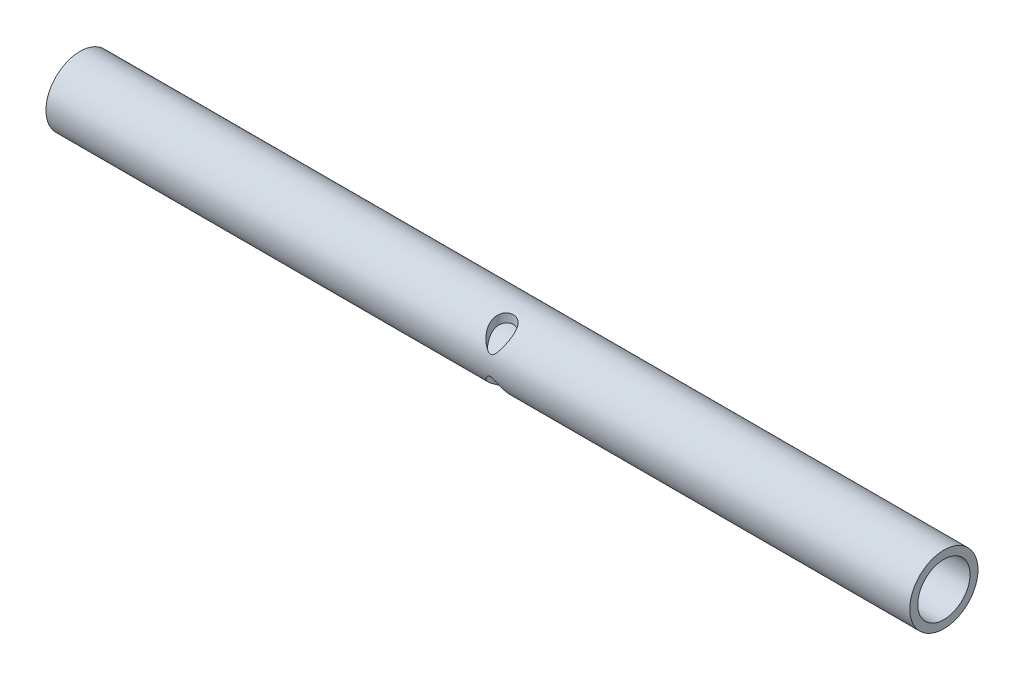
ISO-10303-21;
HEADER;
FILE_DESCRIPTION(('STEP AP214'),'2;1');
FILE_NAME('part.step','',(''),(''),'','','');
FILE_SCHEMA(('AUTOMOTIVE_DESIGN { 1 0 10303 214 1 1 1 1 }'));
ENDSEC;
DATA;
#1=APPLICATION_CONTEXT('core data for automotive mechanical design processes');
#2=APPLICATION_PROTOCOL_DEFINITION('international standard','automotive_design',2000,#1);
#3=PRODUCT_CONTEXT('',#1,'mechanical');
#4=PRODUCT('Part','Part','',(#3));
#5=PRODUCT_RELATED_PRODUCT_CATEGORY('part','',(#4));
#6=PRODUCT_DEFINITION_FORMATION('','',#4);
#7=PRODUCT_DEFINITION_CONTEXT('part definition',#1,'design');
#8=PRODUCT_DEFINITION('design','',#6,#7);
#9=PRODUCT_DEFINITION_SHAPE('','',#8);
#10=(LENGTH_UNIT() NAMED_UNIT(*) SI_UNIT(.MILLI.,.METRE.));
#11=(NAMED_UNIT(*) PLANE_ANGLE_UNIT() SI_UNIT($,.RADIAN.));
#12=(NAMED_UNIT(*) SI_UNIT($,.STERADIAN.) SOLID_ANGLE_UNIT());
#13=UNCERTAINTY_MEASURE_WITH_UNIT(LENGTH_MEASURE(1.E-05),#10,'distance_accuracy_value','');
#14=(GEOMETRIC_REPRESENTATION_CONTEXT(3) GLOBAL_UNCERTAINTY_ASSIGNED_CONTEXT((#13)) GLOBAL_UNIT_ASSIGNED_CONTEXT((#10,
#11,#12)) REPRESENTATION_CONTEXT('',''));
#15=CARTESIAN_POINT('',(0.,0.,0.));
#16=DIRECTION('',(0.,0.,1.));
#17=DIRECTION('',(1.,0.,0.));
#18=AXIS2_PLACEMENT_3D('',#15,#16,#17);
#19=CARTESIAN_POINT('',(-38.608,0.,0.));
#20=DIRECTION('',(1.,0.,0.));
#21=DIRECTION('',(0.,0.,-1.));
#22=AXIS2_PLACEMENT_3D('',#19,#20,#21);
#23=CYLINDRICAL_SURFACE('',#22,3.048);
#24=CARTESIAN_POINT('',(1.01599997728885,2.9147239841999,0.891452800730289));
#25=CARTESIAN_POINT('',(0.961358600201611,2.91472371231652,0.891451407657925));
#26=CARTESIAN_POINT('',(0.906728168522364,2.91338302113587,0.895872552465961));
#27=CARTESIAN_POINT('',(0.799030910011323,2.90793754692367,0.913393277716945));
#28=CARTESIAN_POINT('',(0.745963575420099,2.90383367206002,0.926490006756861));
#29=CARTESIAN_POINT('',(0.642881660583698,2.89263364517143,0.960884529304442));
#30=CARTESIAN_POINT('',(0.592867597479758,2.88553698785123,0.982183707644107));
#31=CARTESIAN_POINT('',(0.497311921369041,2.86803647726898,1.03216690523976));
#32=CARTESIAN_POINT('',(0.451770123851508,2.85763276052026,1.06085061965746));
#33=CARTESIAN_POINT('',(0.366350406686001,2.83319796001081,1.12447812112183));
#34=CARTESIAN_POINT('',(0.326476022349593,2.81916462736359,1.15942578513496));
#35=CARTESIAN_POINT('',(0.253345211723847,2.78726461847409,1.23414207880032));
#36=CARTESIAN_POINT('',(0.220088790521825,2.76939793928511,1.27391071215846));
#37=CARTESIAN_POINT('',(0.159985351052346,2.72931076435654,1.35770849593012));
#38=CARTESIAN_POINT('',(0.133315095483921,2.70699442406045,1.40181809175147));
#39=CARTESIAN_POINT('',(0.0875503194048421,2.65848148224712,1.49177557389392));
#40=CARTESIAN_POINT('',(0.0684579004077292,2.63228380710609,1.53762393856022));
#41=CARTESIAN_POINT('',(0.0361630236985094,2.57388695789537,1.63365714642444));
#42=CARTESIAN_POINT('',(0.0236302042507944,2.54136200911286,1.68386714436391));
#43=CARTESIAN_POINT('',(0.00637361894337863,2.47272803890617,1.78313689490552));
#44=CARTESIAN_POINT('',(0.00165460757690174,2.43661684950317,1.83219592929488));
#45=CARTESIAN_POINT('',(-0.00156615539899686,2.34260390687095,1.95213627201621));
#46=CARTESIAN_POINT('',(0.00421603086375505,2.28282885366832,2.02167502244208));
#47=CARTESIAN_POINT('',(0.0280673519483582,2.15844552075762,2.15400435087498));
#48=CARTESIAN_POINT('',(0.046165832263287,2.09382602636301,2.21677839619412));
#49=CARTESIAN_POINT('',(0.100520127876237,1.93695344796842,2.35652132844664));
#50=CARTESIAN_POINT('',(0.141001636245925,1.84326081796375,2.43024725119752));
#51=CARTESIAN_POINT('',(0.21212432633723,1.70065046654504,2.53011696777654));
#52=CARTESIAN_POINT('',(0.237600631612548,1.65271207214442,2.56165044375464));
#53=CARTESIAN_POINT('',(0.291826434904755,1.55652150971007,2.62120936750617));
#54=CARTESIAN_POINT('',(0.320574627442048,1.50826947401438,2.64923620511912));
#55=CARTESIAN_POINT('',(0.38922544049407,1.39930560808642,2.70869461108573));
#56=CARTESIAN_POINT('',(0.430081377769253,1.3386275364298,2.73910666699216));
#57=CARTESIAN_POINT('',(0.495718153843738,1.24906631197578,2.78050713008649));
#58=CARTESIAN_POINT('',(0.5182809401346,1.21950376122606,2.79358585902179));
#59=CARTESIAN_POINT('',(0.565145538706437,1.16118071169001,2.81832624376024));
#60=CARTESIAN_POINT('',(0.589446483864867,1.13241982279096,2.82998859842878));
#61=CARTESIAN_POINT('',(0.635227835082422,1.08180782475746,2.84966339427361));
#62=CARTESIAN_POINT('',(0.656320763939949,1.05971168869448,2.85794226016422));
#63=CARTESIAN_POINT('',(0.700368404343346,1.0168683358608,2.87346519332981));
#64=CARTESIAN_POINT('',(0.723329035122025,0.996125815534833,2.88070575241722));
#65=CARTESIAN_POINT('',(0.771915797393043,0.956741378345352,2.89402590766576));
#66=CARTESIAN_POINT('',(0.79757534035971,0.938133728385526,2.90008742822188));
#67=CARTESIAN_POINT('',(0.851891620436209,0.905353453920675,2.91048664206569));
#68=CARTESIAN_POINT('',(0.88052726055803,0.891152120596328,2.91483554596542));
#69=CARTESIAN_POINT('',(0.926840799411878,0.875157866573962,2.91966416307128));
#70=CARTESIAN_POINT('',(0.943476333475772,0.870663117049327,2.92100326395452));
#71=CARTESIAN_POINT('',(0.977297530132701,0.864423477606222,2.92285594963522));
#72=CARTESIAN_POINT('',(0.994482346160152,0.862674546295571,2.92337074769294));
#73=CARTESIAN_POINT('',(1.02894909752674,0.862179691701493,2.92351678830325));
#74=CARTESIAN_POINT('',(1.04623117006838,0.863442182088024,2.92314555535477));
#75=CARTESIAN_POINT('',(1.08031466706393,0.868793648107052,2.921559316873));
#76=CARTESIAN_POINT('',(1.09711540830857,0.872886452383716,2.92034316838865));
#77=CARTESIAN_POINT('',(1.13635997524289,0.885459683404001,2.91656001959532));
#78=CARTESIAN_POINT('',(1.15841203702743,0.89503455747435,2.9136492106886));
#79=CARTESIAN_POINT('',(1.20075541789173,0.91720843572623,2.90674522075161));
#80=CARTESIAN_POINT('',(1.22104076831775,0.929817187906055,2.90274854532151));
#81=CARTESIAN_POINT('',(1.26519817764603,0.960556277462799,2.89274260847214));
#82=CARTESIAN_POINT('',(1.28860176447483,0.979265285313742,2.88648059814074));
#83=CARTESIAN_POINT('',(1.33347830399125,1.01853500041961,2.87286051319339));
#84=CARTESIAN_POINT('',(1.35494742885931,1.03909922454783,2.8655003387987));
#85=CARTESIAN_POINT('',(1.41728641568101,1.10266109725883,2.84191413428093));
#86=CARTESIAN_POINT('',(1.45586700343032,1.14735219968793,2.82423753890277));
#87=CARTESIAN_POINT('',(1.5308505653868,1.24099436194374,2.78441884437483));
#88=CARTESIAN_POINT('',(1.56701978317381,1.29004479925315,2.76208568745772));
#89=CARTESIAN_POINT('',(1.63567641832027,1.388962596208,2.71369146081225));
#90=CARTESIAN_POINT('',(1.66815996827205,1.43883075225026,2.6876265389797));
#91=CARTESIAN_POINT('',(1.72960682791083,1.53849808737096,2.63184044430761));
#92=CARTESIAN_POINT('',(1.75857798405406,1.58829716499047,2.60212773109367));
#93=CARTESIAN_POINT('',(1.81299312503636,1.68744529772475,2.53895457908662));
#94=CARTESIAN_POINT('',(1.83843667968931,1.7367942972688,2.5054936841059));
#95=CARTESIAN_POINT('',(1.90014406802915,1.86510676467178,2.41273082331714));
#96=CARTESIAN_POINT('',(1.93328387424042,1.94338201824763,2.35030918386092));
#97=CARTESIAN_POINT('',(1.98684430681074,2.09564675498007,2.21559299588647));
#98=CARTESIAN_POINT('',(2.00728785222751,2.16964374082146,2.14331652657156));
#99=CARTESIAN_POINT('',(2.02837131376352,2.29224995491034,2.01041436716106));
#100=CARTESIAN_POINT('',(2.0328332605866,2.34237539138363,1.95180587256903));
#101=CARTESIAN_POINT('',(2.0309134658607,2.43794272593791,1.83102042191498));
#102=CARTESIAN_POINT('',(2.02454549777405,2.48339049512433,1.76884809547722));
#103=CARTESIAN_POINT('',(2.00130699700227,2.5609558918398,1.65400974921501));
#104=CARTESIAN_POINT('',(1.98646098755912,2.59401614580604,1.60157604993669));
#105=CARTESIAN_POINT('',(1.94727171201677,2.65546480613445,1.49748279785329));
#106=CARTESIAN_POINT('',(1.92293228796902,2.68385509586389,1.44582294064046));
#107=CARTESIAN_POINT('',(1.86427344984575,2.73566945856347,1.34522878996537));
#108=CARTESIAN_POINT('',(1.82989512215635,2.75906276153833,1.29631267852944));
#109=CARTESIAN_POINT('',(1.75166835274749,2.8005347407032,1.20410560809732));
#110=CARTESIAN_POINT('',(1.70782374423201,2.81861556111365,1.16081238354319));
#111=CARTESIAN_POINT('',(1.61703079364987,2.84805647254598,1.08642195066302));
#112=CARTESIAN_POINT('',(1.57090545476637,2.85992612336544,1.05451807463382));
#113=CARTESIAN_POINT('',(1.47340541009647,2.87996379199398,0.998499158965098));
#114=CARTESIAN_POINT('',(1.42203024392232,2.88813148481495,0.974384803206631));
#115=CARTESIAN_POINT('',(1.31274899359651,2.90147976967837,0.93391793204557));
#116=CARTESIAN_POINT('',(1.25464053934466,2.90647711943895,0.91804984216211));
#117=CARTESIAN_POINT('',(1.13635020922549,2.91309927568578,0.896818357173713));
#118=CARTESIAN_POINT('',(1.07616845740398,2.91472428358492,0.891454334715179));
#119=CARTESIAN_POINT('',(1.01599997728885,2.9147239841999,0.891452800730289));
#120=B_SPLINE_CURVE_WITH_KNOTS('',3,(#24,#25,#26,#27,#28,#29,#30,#31,#32,#33,#34,#35,#36,#37,
#38,#39,#40,#41,#42,#43,#44,#45,#46,#47,#48,#49,#50,#51,#52,#53,#54,#55,#56,#57,#58,#59,#60,#61,
#62,#63,#64,#65,#66,#67,#68,#69,#70,#71,#72,#73,#74,#75,#76,#77,#78,#79,#80,#81,#82,#83,#84,#85,
#86,#87,#88,#89,#90,#91,#92,#93,#94,#95,#96,#97,#98,#99,#100,#101,#102,#103,#104,#105,#106,#107,
#108,#109,#110,#111,#112,#113,#114,#115,#116,#117,#118,#119),.UNSPECIFIED.,.T.,.F.,(4,2,2,2,2,2,
2,2,2,2,2,2,2,2,2,2,2,2,2,2,2,2,2,2,2,2,2,2,2,2,2,2,2,2,2,2,2,2,2,2,2,2,2,2,2,2,2,4),(0.,
0.163711435285652,0.327369090236526,0.491054387880249,0.654732929575121,0.818513129396463,
0.982293455117346,1.15008171567064,1.31791647542394,1.50058360414655,1.6833618401417,
1.95745489422072,2.23220331496813,2.60776283804053,2.79597638017617,2.98411508685182,
3.22134007440059,3.33955526491116,3.45771188680519,3.55259116394368,3.64778382096762,
3.74433726072978,3.84024772599146,3.89189254099363,3.94346127183437,3.99517425024448,
4.04695731942534,4.11919094434317,4.19165983362267,4.28327632151749,4.37507028739646,
4.55951240420825,4.75402055223612,4.94873094807711,5.14299802948225,5.33728878069025,
5.65252659321788,5.96719367739586,6.19813221412231,6.42877726330678,6.61921246433551,
6.80957067473808,7.0010692639285,7.19249045408204,7.36359986449195,7.53472429337485,
7.71500629068832,7.89527752036247),.UNSPECIFIED.);
#121=CARTESIAN_POINT('',(1.01599997728885,2.9147239841999,0.891452800730289));
#122=VERTEX_POINT('',#121);
#123=EDGE_CURVE('E53',#122,#122,#120,.T.);
#124=ORIENTED_EDGE('',*,*,#123,.F.);
#125=EDGE_LOOP('',(#124));
#126=FACE_BOUND('',#125,.T.);
#127=CARTESIAN_POINT('',(1.01599997728885,-2.9147239841999,0.891452800730289));
#128=CARTESIAN_POINT('',(1.07064135437608,-2.91472371231652,0.891451407657925));
#129=CARTESIAN_POINT('',(1.12527178605533,-2.91338302113587,0.895872552465961));
#130=CARTESIAN_POINT('',(1.23296904456637,-2.90793754692367,0.913393277716945));
#131=CARTESIAN_POINT('',(1.28603637915759,-2.90383367206002,0.926490006756861));
#132=CARTESIAN_POINT('',(1.389118293994,-2.89263364517143,0.960884529304443));
#133=CARTESIAN_POINT('',(1.43913235709794,-2.88553698785123,0.982183707644107));
#134=CARTESIAN_POINT('',(1.53468803320865,-2.86803647726898,1.03216690523976));
#135=CARTESIAN_POINT('',(1.58022983072619,-2.85763276052026,1.06085061965746));
#136=CARTESIAN_POINT('',(1.66564954789169,-2.83319796001081,1.12447812112183));
#137=CARTESIAN_POINT('',(1.7055239322281,-2.81916462736358,1.15942578513496));
#138=CARTESIAN_POINT('',(1.77865474285385,-2.78726461847409,1.23414207880032));
#139=CARTESIAN_POINT('',(1.81191116405587,-2.76939793928511,1.27391071215846));
#140=CARTESIAN_POINT('',(1.87201460352535,-2.72931076435654,1.35770849593012));
#141=CARTESIAN_POINT('',(1.89868485909377,-2.70699442406045,1.40181809175147));
#142=CARTESIAN_POINT('',(1.94444963517285,-2.65848148224712,1.49177557389392));
#143=CARTESIAN_POINT('',(1.96354205416996,-2.63228380710609,1.53762393856022));
#144=CARTESIAN_POINT('',(1.99583693087918,-2.57388695789537,1.63365714642444));
#145=CARTESIAN_POINT('',(2.0083697503269,-2.54136200911286,1.68386714436391));
#146=CARTESIAN_POINT('',(2.02562633563431,-2.47272803890617,1.78313689490552));
#147=CARTESIAN_POINT('',(2.03034534700079,-2.43661684950317,1.83219592929488));
#148=CARTESIAN_POINT('',(2.03356610997669,-2.34260390687095,1.95213627201621));
#149=CARTESIAN_POINT('',(2.02778392371394,-2.28282885366831,2.02167502244208));
#150=CARTESIAN_POINT('',(2.00393260262933,-2.15844552075762,2.15400435087498));
#151=CARTESIAN_POINT('',(1.98583412231441,-2.09382602636301,2.21677839619412));
#152=CARTESIAN_POINT('',(1.93147982670146,-1.93695344796842,2.35652132844664));
#153=CARTESIAN_POINT('',(1.89099831833177,-1.84326081796375,2.43024725119752));
#154=CARTESIAN_POINT('',(1.81987562824046,-1.70065046654504,2.53011696777654));
#155=CARTESIAN_POINT('',(1.79439932296514,-1.65271207214442,2.56165044375464));
#156=CARTESIAN_POINT('',(1.74017351967294,-1.55652150971007,2.62120936750618));
#157=CARTESIAN_POINT('',(1.71142532713564,-1.50826947401438,2.64923620511912));
#158=CARTESIAN_POINT('',(1.64277451408362,-1.39930560808642,2.70869461108574));
#159=CARTESIAN_POINT('',(1.60191857680844,-1.3386275364298,2.73910666699216));
#160=CARTESIAN_POINT('',(1.53628180073395,-1.24906631197578,2.78050713008649));
#161=CARTESIAN_POINT('',(1.51371901444309,-1.21950376122606,2.79358585902179));
#162=CARTESIAN_POINT('',(1.46685441587126,-1.16118071169001,2.81832624376024));
#163=CARTESIAN_POINT('',(1.44255347071283,-1.13241982279096,2.82998859842878));
#164=CARTESIAN_POINT('',(1.39677211949527,-1.08180782475746,2.84966339427361));
#165=CARTESIAN_POINT('',(1.37567919063774,-1.05971168869448,2.85794226016422));
#166=CARTESIAN_POINT('',(1.33163155023435,-1.0168683358608,2.87346519332981));
#167=CARTESIAN_POINT('',(1.30867091945567,-0.996125815534832,2.88070575241722));
#168=CARTESIAN_POINT('',(1.26008415718465,-0.956741378345351,2.89402590766576));
#169=CARTESIAN_POINT('',(1.23442461421798,-0.938133728385526,2.90008742822188));
#170=CARTESIAN_POINT('',(1.18010833414148,-0.905353453920674,2.91048664206569));
#171=CARTESIAN_POINT('',(1.15147269401966,-0.891152120596326,2.91483554596542));
#172=CARTESIAN_POINT('',(1.10515915516581,-0.87515786657396,2.91966416307128));
#173=CARTESIAN_POINT('',(1.08852362110192,-0.870663117049325,2.92100326395452));
#174=CARTESIAN_POINT('',(1.05470242444499,-0.864423477606221,2.92285594963522));
#175=CARTESIAN_POINT('',(1.03751760841754,-0.862674546295569,2.92337074769294));
#176=CARTESIAN_POINT('',(1.00305085705095,-0.862179691701492,2.92351678830325));
#177=CARTESIAN_POINT('',(0.985768784509311,-0.863442182088023,2.92314555535477));
#178=CARTESIAN_POINT('',(0.951685287513763,-0.868793648107052,2.921559316873));
#179=CARTESIAN_POINT('',(0.93488454626912,-0.872886452383717,2.92034316838865));
#180=CARTESIAN_POINT('',(0.895639979334805,-0.885459683404002,2.91656001959532));
#181=CARTESIAN_POINT('',(0.873587917550258,-0.895034557474352,2.9136492106886));
#182=CARTESIAN_POINT('',(0.831244536685965,-0.917208435726233,2.90674522075161));
#183=CARTESIAN_POINT('',(0.810959186259937,-0.929817187906057,2.90274854532151));
#184=CARTESIAN_POINT('',(0.76680177693166,-0.960556277462801,2.89274260847214));
#185=CARTESIAN_POINT('',(0.743398190102865,-0.979265285313745,2.88648059814074));
#186=CARTESIAN_POINT('',(0.698521650586445,-1.01853500041961,2.87286051319339));
#187=CARTESIAN_POINT('',(0.677052525718377,-1.03909922454784,2.86550033879869));
#188=CARTESIAN_POINT('',(0.614713538896677,-1.10266109725884,2.84191413428093));
#189=CARTESIAN_POINT('',(0.576132951147364,-1.14735219968794,2.82423753890277));
#190=CARTESIAN_POINT('',(0.501149389190886,-1.24099436194375,2.78441884437483));
#191=CARTESIAN_POINT('',(0.464980171403882,-1.29004479925316,2.76208568745772));
#192=CARTESIAN_POINT('',(0.396323536257416,-1.388962596208,2.71369146081225));
#193=CARTESIAN_POINT('',(0.36383998630564,-1.43883075225027,2.68762653897969));
#194=CARTESIAN_POINT('',(0.302393126666858,-1.53849808737097,2.63184044430761));
#195=CARTESIAN_POINT('',(0.273421970523625,-1.58829716499048,2.60212773109367));
#196=CARTESIAN_POINT('',(0.219006829541327,-1.68744529772476,2.53895457908661));
#197=CARTESIAN_POINT('',(0.193563274888378,-1.73679429726882,2.50549368410589));
#198=CARTESIAN_POINT('',(0.131855886548538,-1.86510676467179,2.41273082331713));
#199=CARTESIAN_POINT('',(0.0987160803372649,-1.94338201824764,2.35030918386091));
#200=CARTESIAN_POINT('',(0.0451556477669541,-2.09564675498008,2.21559299588646));
#201=CARTESIAN_POINT('',(0.0247121023501825,-2.16964374082147,2.14331652657156));
#202=CARTESIAN_POINT('',(0.00362864081417328,-2.29224995491034,2.01041436716106));
#203=CARTESIAN_POINT('',(-0.000833306008908053,-2.34237539138364,1.95180587256902));
#204=CARTESIAN_POINT('',(0.00108648871699837,-2.43794272593792,1.83102042191497));
#205=CARTESIAN_POINT('',(0.00745445680364191,-2.48339049512434,1.76884809547721));
#206=CARTESIAN_POINT('',(0.0306929575754301,-2.5609558918398,1.65400974921501));
#207=CARTESIAN_POINT('',(0.0455389670185756,-2.59401614580604,1.60157604993669));
#208=CARTESIAN_POINT('',(0.0847282425609217,-2.65546480613445,1.49748279785329));
#209=CARTESIAN_POINT('',(0.109067666608678,-2.6838550958639,1.44582294064045));
#210=CARTESIAN_POINT('',(0.167726504731951,-2.73566945856348,1.34522878996536));
#211=CARTESIAN_POINT('',(0.202104832421347,-2.75906276153833,1.29631267852943));
#212=CARTESIAN_POINT('',(0.280331601830209,-2.8005347407032,1.20410560809731));
#213=CARTESIAN_POINT('',(0.32417621034569,-2.81861556111365,1.16081238354318));
#214=CARTESIAN_POINT('',(0.414969160927829,-2.84805647254598,1.08642195066302));
#215=CARTESIAN_POINT('',(0.461094499811324,-2.85992612336545,1.05451807463382));
#216=CARTESIAN_POINT('',(0.558594544481231,-2.87996379199398,0.998499158965096));
#217=CARTESIAN_POINT('',(0.609969710655373,-2.88813148481495,0.974384803206629));
#218=CARTESIAN_POINT('',(0.719250960981189,-2.90147976967838,0.933917932045569));
#219=CARTESIAN_POINT('',(0.777359415233036,-2.90647711943895,0.918049842162109));
#220=CARTESIAN_POINT('',(0.895649745352204,-2.91309927568578,0.896818357173713));
#221=CARTESIAN_POINT('',(0.955831497173713,-2.91472428358492,0.891454334715179));
#222=CARTESIAN_POINT('',(1.01599997728885,-2.9147239841999,0.891452800730289));
#223=B_SPLINE_CURVE_WITH_KNOTS('',3,(#127,#128,#129,#130,#131,#132,#133,#134,#135,#136,#137,
#138,#139,#140,#141,#142,#143,#144,#145,#146,#147,#148,#149,#150,#151,#152,#153,#154,#155,#156,
#157,#158,#159,#160,#161,#162,#163,#164,#165,#166,#167,#168,#169,#170,#171,#172,#173,#174,#175,
#176,#177,#178,#179,#180,#181,#182,#183,#184,#185,#186,#187,#188,#189,#190,#191,#192,#193,#194,
#195,#196,#197,#198,#199,#200,#201,#202,#203,#204,#205,#206,#207,#208,#209,#210,#211,#212,#213,
#214,#215,#216,#217,#218,#219,#220,#221,#222),.UNSPECIFIED.,.T.,.F.,(4,2,2,2,2,2,2,2,2,2,2,2,2,
2,2,2,2,2,2,2,2,2,2,2,2,2,2,2,2,2,2,2,2,2,2,2,2,2,2,2,2,2,2,2,2,2,2,4),(0.,0.163711435285652,
0.327369090236526,0.49105438788025,0.654732929575121,0.818513129396463,0.982293455117347,
1.15008171567064,1.31791647542394,1.50058360414655,1.6833618401417,1.95745489422072,
2.23220331496813,2.60776283804053,2.79597638017617,2.98411508685182,3.2213400744006,
3.33955526491116,3.45771188680519,3.55259116394369,3.64778382096762,3.74433726072978,
3.84024772599147,3.89189254099364,3.94346127183437,3.99517425024448,4.04695731942534,
4.11919094434318,4.19165983362267,4.2832763215175,4.37507028739646,4.55951240420826,
4.75402055223613,4.94873094807712,5.14299802948226,5.33728878069027,5.6525265932179,
5.96719367739587,6.19813221412232,6.42877726330679,6.61921246433552,6.80957067473809,
7.00106926392851,7.19249045408205,7.36359986449196,7.53472429337485,7.71500629068833,
7.89527752036247),.UNSPECIFIED.);
#224=CARTESIAN_POINT('',(1.01599997728885,-2.9147239841999,0.891452800730289));
#225=VERTEX_POINT('',#224);
#226=EDGE_CURVE('E58',#225,#225,#223,.T.);
#227=ORIENTED_EDGE('',*,*,#226,.F.);
#228=EDGE_LOOP('',(#227));
#229=FACE_BOUND('',#228,.T.);
#230=CARTESIAN_POINT('',(-38.608,0.,0.));
#231=DIRECTION('',(1.,0.,0.));
#232=DIRECTION('',(0.,0.,-1.));
#233=AXIS2_PLACEMENT_3D('',#230,#231,#232);
#234=CIRCLE('',#233,3.048);
#235=CARTESIAN_POINT('',(-38.608,0.,-3.048));
#236=VERTEX_POINT('',#235);
#237=EDGE_CURVE('E10',#236,#236,#234,.T.);
#238=ORIENTED_EDGE('',*,*,#237,.T.);
#239=EDGE_LOOP('',(#238));
#240=FACE_BOUND('',#239,.T.);
#241=CARTESIAN_POINT('',(38.608,0.,0.));
#242=DIRECTION('',(1.,0.,0.));
#243=DIRECTION('',(0.,0.,-1.));
#244=AXIS2_PLACEMENT_3D('',#241,#242,#243);
#245=CIRCLE('',#244,3.048);
#246=CARTESIAN_POINT('',(38.608,0.,-3.048));
#247=VERTEX_POINT('',#246);
#248=EDGE_CURVE('E45',#247,#247,#245,.T.);
#249=ORIENTED_EDGE('',*,*,#248,.F.);
#250=EDGE_LOOP('',(#249));
#251=FACE_BOUND('',#250,.T.);
#252=ADVANCED_FACE('F29',(#126,#229,#240,#251),#23,.T.);
#253=CARTESIAN_POINT('',(-38.608,0.,0.));
#254=DIRECTION('',(1.,0.,0.));
#255=DIRECTION('',(0.,0.,-1.));
#256=AXIS2_PLACEMENT_3D('',#253,#254,#255);
#257=PLANE('',#256);
#258=CARTESIAN_POINT('',(-38.608,0.,0.));
#259=DIRECTION('',(1.,0.,0.));
#260=DIRECTION('',(0.,0.,-1.));
#261=AXIS2_PLACEMENT_3D('',#258,#259,#260);
#262=CIRCLE('',#261,2.3368);
#263=CARTESIAN_POINT('',(-38.608,0.,-2.3368));
#264=VERTEX_POINT('',#263);
#265=EDGE_CURVE('E41',#264,#264,#262,.T.);
#266=ORIENTED_EDGE('',*,*,#265,.T.);
#267=EDGE_LOOP('',(#266));
#268=FACE_BOUND('',#267,.T.);
#269=ORIENTED_EDGE('',*,*,#237,.F.);
#270=EDGE_LOOP('',(#269));
#271=FACE_BOUND('',#270,.T.);
#272=ADVANCED_FACE('F74',(#268,#271),#257,.F.);
#273=CARTESIAN_POINT('',(-38.608,0.,0.));
#274=DIRECTION('',(1.,0.,0.));
#275=DIRECTION('',(0.,0.,-1.));
#276=AXIS2_PLACEMENT_3D('',#273,#274,#275);
#277=CYLINDRICAL_SURFACE('',#276,2.3368);
#278=CARTESIAN_POINT('',(1.01599997728885,2.16008012445606,0.891452800730289));
#279=CARTESIAN_POINT('',(0.963287929247029,2.16008071106945,0.891455458737247));
#280=CARTESIAN_POINT('',(0.910511251816393,2.15839294747281,0.895575443203277));
#281=CARTESIAN_POINT('',(0.806385566241862,2.15154113952761,0.911910411367164));
#282=CARTESIAN_POINT('',(0.755039542722356,2.14637032287911,0.924141164577876));
#283=CARTESIAN_POINT('',(0.655339967717402,2.13228887170314,0.956181270332728));
#284=CARTESIAN_POINT('',(0.60698437938447,2.12338081560733,0.975985396951373));
#285=CARTESIAN_POINT('',(0.514626176217709,2.10148713858706,1.02227077693178));
#286=CARTESIAN_POINT('',(0.470621033285559,2.0885039043333,1.04874812027061));
#287=CARTESIAN_POINT('',(0.38804588928283,2.05813935888545,1.10714765701369));
#288=CARTESIAN_POINT('',(0.349479243829283,2.04075535068972,1.13907318539828));
#289=CARTESIAN_POINT('',(0.278598707842915,2.00144322189007,1.206809947824));
#290=CARTESIAN_POINT('',(0.246285538473813,1.97951457779254,1.24262162928194));
#291=CARTESIAN_POINT('',(0.187201933658929,1.93033090439019,1.31777821398339));
#292=CARTESIAN_POINT('',(0.160669525241045,1.90291416572699,1.35720348265624));
#293=CARTESIAN_POINT('',(0.114466055066961,1.84363856984114,1.4366969393596));
#294=CARTESIAN_POINT('',(0.0947981010171699,1.81177770976825,1.47676541001934));
#295=CARTESIAN_POINT('',(0.0548276335690087,1.73000118046561,1.57262683692824));
#296=CARTESIAN_POINT('',(0.0376642291701286,1.67808811636707,1.62802773012733));
#297=CARTESIAN_POINT('',(0.0133374663849289,1.56785157063654,1.73447322956056));
#298=CARTESIAN_POINT('',(0.00619618474195931,1.50951424128967,1.78550798675812));
#299=CARTESIAN_POINT('',(-0.00234140586970139,1.3613714153217,1.90253579189229));
#300=CARTESIAN_POINT('',(0.000100335156349867,1.26889632409922,1.96540894758548));
#301=CARTESIAN_POINT('',(0.0126931634456803,1.07635347546616,2.07715715246086));
#302=CARTESIAN_POINT('',(0.0228600947861829,0.976270494707645,2.12600314838755));
#303=CARTESIAN_POINT('',(0.0453044677110911,0.765763599221644,2.21080158137671));
#304=CARTESIAN_POINT('',(0.0576549853436447,0.655078574884131,2.2460935942212));
#305=CARTESIAN_POINT('',(0.0732281928082164,0.485952740914614,2.28644843733005));
#306=CARTESIAN_POINT('',(0.077925848597587,0.429084971646151,2.29780078161003));
#307=CARTESIAN_POINT('',(0.0858177761196293,0.314567393753604,2.31625579825321));
#308=CARTESIAN_POINT('',(0.089012587628558,0.256917873576636,2.32335999667108));
#309=CARTESIAN_POINT('',(0.0937698478649852,0.134608846108455,2.3338158718164));
#310=CARTESIAN_POINT('',(0.0951061921998475,0.0698955237241698,2.33665085920698));
#311=CARTESIAN_POINT('',(0.0952402651072754,-0.0595492675228346,2.33693768869241));
#312=CARTESIAN_POINT('',(0.0940377894427269,-0.12428073742659,2.3343890977016));
#313=CARTESIAN_POINT('',(0.0892666444135661,-0.253324995799168,2.32393150959779));
#314=CARTESIAN_POINT('',(0.0856941703098446,-0.317636942855891,2.31601389272457));
#315=CARTESIAN_POINT('',(0.0767096494695911,-0.445239538097893,2.29490319987788));
#316=CARTESIAN_POINT('',(0.0712975939841287,-0.508530181424416,2.28171009881449));
#317=CARTESIAN_POINT('',(0.0541283918739516,-0.689020297204121,2.23621614963027));
#318=CARTESIAN_POINT('',(0.040987923131621,-0.804480133232396,2.19732925037919));
#319=CARTESIAN_POINT('',(0.0175944512605344,-1.02813422137021,2.10198018721826));
#320=CARTESIAN_POINT('',(0.0073381944734487,-1.13633655478967,2.04553797999443));
#321=CARTESIAN_POINT('',(-0.000645534632304465,-1.31253945566301,1.93526977742509));
#322=CARTESIAN_POINT('',(-0.0011750557429321,-1.38298830844703,1.88557729410126));
#323=CARTESIAN_POINT('',(0.00674602471103826,-1.51764582265997,1.77896343521836));
#324=CARTESIAN_POINT('',(0.0151797619595433,-1.58186595571051,1.72205581202842));
#325=CARTESIAN_POINT('',(0.0413330582279514,-1.68849992487947,1.6167479696705));
#326=CARTESIAN_POINT('',(0.0564896526471132,-1.73254295708544,1.5693761625361));
#327=CARTESIAN_POINT('',(0.0959352822739489,-1.81487856761723,1.473375470159));
#328=CARTESIAN_POINT('',(0.120219898685441,-1.8531739158154,1.4247472037476));
#329=CARTESIAN_POINT('',(0.179270806626985,-1.92346347352853,1.32835056452978));
#330=CARTESIAN_POINT('',(0.214133796129779,-1.95539484718673,1.2805946274934));
#331=CARTESIAN_POINT('',(0.29432620498332,-2.01196511339691,1.18974783702972));
#332=CARTESIAN_POINT('',(0.339647386038935,-2.0366097113269,1.1466533506504));
#333=CARTESIAN_POINT('',(0.431954175730012,-2.07553092145935,1.07435482921959));
#334=CARTESIAN_POINT('',(0.477650482478616,-2.0908120525674,1.04403567475014));
#335=CARTESIAN_POINT('',(0.574392721851094,-2.1165682642808,0.990783195680304));
#336=CARTESIAN_POINT('',(0.625437238303017,-2.12704461323082,0.967847922393315));
#337=CARTESIAN_POINT('',(0.727790875304791,-2.14308055144648,0.931775600799051));
#338=CARTESIAN_POINT('',(0.778868551611202,-2.14891473540262,0.918099973398574));
#339=CARTESIAN_POINT('',(0.88279738432586,-2.15704337489288,0.898837481442092));
#340=CARTESIAN_POINT('',(0.935648332064487,-2.15933824543324,0.893249668544907));
#341=CARTESIAN_POINT('',(1.04136471093689,-2.16051483884584,0.890400042106804));
#342=CARTESIAN_POINT('',(1.09422894041522,-2.15941232641159,0.893099772104752));
#343=CARTESIAN_POINT('',(1.19871918350137,-2.15376591259275,0.906630885849086));
#344=CARTESIAN_POINT('',(1.25034520772263,-2.1492220407171,0.917462199868842));
#345=CARTESIAN_POINT('',(1.35091161520663,-2.13645481081793,0.94681001269136));
#346=CARTESIAN_POINT('',(1.39985085753703,-2.12822990301789,0.965329748207732));
#347=CARTESIAN_POINT('',(1.49363114778016,-2.10776473508943,1.00923004975604));
#348=CARTESIAN_POINT('',(1.53847280099307,-2.09552506925529,1.03460960024948));
#349=CARTESIAN_POINT('',(1.62288455566054,-2.06670248076338,1.09104295372528));
#350=CARTESIAN_POINT('',(1.66245365337189,-2.0501187328942,1.12209783446665));
#351=CARTESIAN_POINT('',(1.73545091219786,-2.01242586409582,1.1883714621888));
#352=CARTESIAN_POINT('',(1.7688790303862,-1.99131671153564,1.22359023827295));
#353=CARTESIAN_POINT('',(1.83010675642181,-1.9438971758517,1.29764557578595));
#354=CARTESIAN_POINT('',(1.85770454292684,-1.91744827475724,1.3365595357187));
#355=CARTESIAN_POINT('',(1.90605044384113,-1.86008509656895,1.41530866543683));
#356=CARTESIAN_POINT('',(1.92679554866657,-1.82916886604359,1.45514423178008));
#357=CARTESIAN_POINT('',(1.96885851868302,-1.75042387330553,1.54975898613388));
#358=CARTESIAN_POINT('',(1.98722357104282,-1.70071124522983,1.60428561075966));
#359=CARTESIAN_POINT('',(2.01401458523425,-1.59495054753174,1.70949628920654));
#360=CARTESIAN_POINT('',(2.02241950483025,-1.53888933818558,1.76017199692116));
#361=CARTESIAN_POINT('',(2.03385951368626,-1.39671327359362,1.87655757197484));
#362=CARTESIAN_POINT('',(2.03306572800251,-1.30799206606714,1.93943950109581));
#363=CARTESIAN_POINT('',(2.02324082055347,-1.12305394844218,2.05212066423544));
#364=CARTESIAN_POINT('',(2.01419297049479,-1.02682217921044,2.10189306542328));
#365=CARTESIAN_POINT('',(1.99313868412294,-0.824131726211959,2.18955519480867));
#366=CARTESIAN_POINT('',(1.98101719487582,-0.717407527584197,2.22680759262533));
#367=CARTESIAN_POINT('',(1.96490931973477,-0.554082131208932,2.27086110855426));
#368=CARTESIAN_POINT('',(1.95988680615073,-0.499115410469494,2.28357297166525));
#369=CARTESIAN_POINT('',(1.95106579799561,-0.388317168377588,2.30499983260117));
#370=CARTESIAN_POINT('',(1.94726690351615,-0.332485935833543,2.31371613666651));
#371=CARTESIAN_POINT('',(1.94086113153326,-0.211544980184848,2.32812011927255));
#372=CARTESIAN_POINT('',(1.93853022627211,-0.146338237101265,2.33312909392023));
#373=CARTESIAN_POINT('',(1.93642522817958,-0.0156885147398675,2.33766144856151));
#374=CARTESIAN_POINT('',(1.93665131958879,0.0497544812211667,2.33718443327018));
#375=CARTESIAN_POINT('',(1.93962982569198,0.180386830602999,2.33074572266385));
#376=CARTESIAN_POINT('',(1.94238509638244,0.245575813598738,2.32477782692643));
#377=CARTESIAN_POINT('',(1.95000374019569,0.375085135551998,2.30742650213975));
#378=CARTESIAN_POINT('',(1.95486711210184,0.439405475010818,2.29604307621595));
#379=CARTESIAN_POINT('',(1.97077170773929,0.621127183215299,2.25597830267779));
#380=CARTESIAN_POINT('',(1.9835436779187,0.736997845402351,2.22082483964615));
#381=CARTESIAN_POINT('',(2.00768532090835,0.962017269618182,2.13301078007348));
#382=CARTESIAN_POINT('',(2.01905566986108,1.07116925991224,2.08035867055157));
#383=CARTESIAN_POINT('',(2.03084959437639,1.25387994096322,1.97397585126835));
#384=CARTESIAN_POINT('',(2.03332045806663,1.32943583099554,1.92391803954749));
#385=CARTESIAN_POINT('',(2.02927544787216,1.47405739973812,1.81546196973474));
#386=CARTESIAN_POINT('',(2.02277702264702,1.54313540144786,1.75708010302719));
#387=CARTESIAN_POINT('',(1.99983795238047,1.65658383516808,1.64950520659348));
#388=CARTESIAN_POINT('',(1.98629218552821,1.70281141698151,1.60166864626419));
#389=CARTESIAN_POINT('',(1.94999898113594,1.78946094910017,1.50422425819917));
#390=CARTESIAN_POINT('',(1.92726292482888,1.82988999670159,1.45461869022604));
#391=CARTESIAN_POINT('',(1.87565740389151,1.89824804898042,1.36382235582485));
#392=CARTESIAN_POINT('',(1.84827884841652,1.92714325906731,1.3225159058247));
#393=CARTESIAN_POINT('',(1.78580959691179,1.97970466155546,1.2424551068492));
#394=CARTESIAN_POINT('',(1.75072164204632,2.0033727065518,1.20369985711496));
#395=CARTESIAN_POINT('',(1.6731087632507,2.04545570159543,1.13072203066557));
#396=CARTESIAN_POINT('',(1.63055806797178,2.06385184640658,1.09651590784857));
#397=CARTESIAN_POINT('',(1.53913908000888,2.0955082140078,1.03474213705613));
#398=CARTESIAN_POINT('',(1.49026799393544,2.10876615547651,1.00717743987084));
#399=CARTESIAN_POINT('',(1.39129765763662,2.1298045133511,0.961847302119171));
#400=CARTESIAN_POINT('',(1.34151045035843,2.13789728186774,0.943541020391254));
#401=CARTESIAN_POINT('',(1.23932492110096,2.15031697023637,0.914887205716827));
#402=CARTESIAN_POINT('',(1.18693236556847,2.15465184672901,0.904522862616783));
#403=CARTESIAN_POINT('',(1.11446076117389,2.15818137113692,0.896041839328101));
#404=CARTESIAN_POINT('',(1.09481743074473,2.1588938637209,0.894322706127589));
#405=CARTESIAN_POINT('',(1.05545241126093,2.15984313162564,0.892027686883575));
#406=CARTESIAN_POINT('',(1.03573072186624,2.16007990487972,0.891451805806769));
#407=CARTESIAN_POINT('',(1.01599997728885,2.16008012445606,0.891452800730289));
#408=B_SPLINE_CURVE_WITH_KNOTS('',3,(#278,#279,#280,#281,#282,#283,#284,#285,#286,#287,#288,
#289,#290,#291,#292,#293,#294,#295,#296,#297,#298,#299,#300,#301,#302,#303,#304,#305,#306,#307,
#308,#309,#310,#311,#312,#313,#314,#315,#316,#317,#318,#319,#320,#321,#322,#323,#324,#325,#326,
#327,#328,#329,#330,#331,#332,#333,#334,#335,#336,#337,#338,#339,#340,#341,#342,#343,#344,#345,
#346,#347,#348,#349,#350,#351,#352,#353,#354,#355,#356,#357,#358,#359,#360,#361,#362,#363,#364,
#365,#366,#367,#368,#369,#370,#371,#372,#373,#374,#375,#376,#377,#378,#379,#380,#381,#382,#383,
#384,#385,#386,#387,#388,#389,#390,#391,#392,#393,#394,#395,#396,#397,#398,#399,#400,#401,#402,
#403,#404,#405,#406,#407),.UNSPECIFIED.,.T.,.F.,(4,2,2,2,2,2,2,2,2,2,2,2,2,2,2,2,2,2,2,2,2,2,2,
2,2,2,2,2,2,2,2,2,2,2,2,2,2,2,2,2,2,2,2,2,2,2,2,2,2,2,2,2,2,2,2,2,2,2,2,2,2,2,2,2,4),(0.,
0.15806163688967,0.316431492613343,0.474692263525507,0.632860519762923,0.791125944621256,
0.949409610111964,1.11332319457625,1.27731089076418,1.50951150721843,1.74222281687218,
2.0759235985326,2.41031064162704,2.75938234518364,2.93377560062878,3.10810617136984,
3.3021992147953,3.49630787276353,3.6907289046854,3.8851508612741,4.25122762641656,
4.61688975109115,4.8747600942911,5.13214611352236,5.33070356317732,5.52916501642962,
5.72949826378878,5.92967423690067,6.09956364298473,6.26940817658211,6.42824777360743,
6.58706874429839,6.74515385814482,6.90323761646,7.06138799333336,7.21951497017154,
7.37767200696995,7.53583014926565,7.6987926177176,7.86182656171305,8.08866123508873,
8.3159742803286,8.64041333223115,8.9655113804536,9.30527500948072,9.47506726050382,
9.64480396286594,9.84084564009219,10.0369014429009,10.2331789082928,10.429456260407,
10.7931885630193,11.1567447086416,11.4279310731065,11.6985906204443,11.9015202131086,
12.1041992644294,12.2755554353487,12.4468507769553,12.6187497445767,12.7907249467732,
12.9509503029328,13.1108355771316,13.1699996648925,13.2291640096829),.UNSPECIFIED.);
#409=CARTESIAN_POINT('',(1.01599997728885,2.16008012445606,0.891452800730289));
#410=VERTEX_POINT('',#409);
#411=EDGE_CURVE('E33',#410,#410,#408,.T.);
#412=ORIENTED_EDGE('',*,*,#411,.T.);
#413=EDGE_LOOP('',(#412));
#414=FACE_BOUND('',#413,.T.);
#415=ORIENTED_EDGE('',*,*,#265,.F.);
#416=EDGE_LOOP('',(#415));
#417=FACE_BOUND('',#416,.T.);
#418=CARTESIAN_POINT('',(38.608,0.,0.));
#419=DIRECTION('',(1.,0.,0.));
#420=DIRECTION('',(0.,0.,-1.));
#421=AXIS2_PLACEMENT_3D('',#418,#419,#420);
#422=CIRCLE('',#421,2.3368);
#423=CARTESIAN_POINT('',(38.608,0.,-2.3368));
#424=VERTEX_POINT('',#423);
#425=EDGE_CURVE('E50',#424,#424,#422,.T.);
#426=ORIENTED_EDGE('',*,*,#425,.T.);
#427=EDGE_LOOP('',(#426));
#428=FACE_BOUND('',#427,.T.);
#429=ADVANCED_FACE('F70',(#414,#417,#428),#277,.F.);
#430=CARTESIAN_POINT('',(38.608,0.,0.));
#431=DIRECTION('',(1.,0.,0.));
#432=DIRECTION('',(0.,0.,-1.));
#433=AXIS2_PLACEMENT_3D('',#430,#431,#432);
#434=PLANE('',#433);
#435=ORIENTED_EDGE('',*,*,#248,.T.);
#436=EDGE_LOOP('',(#435));
#437=FACE_BOUND('',#436,.T.);
#438=ORIENTED_EDGE('',*,*,#425,.F.);
#439=EDGE_LOOP('',(#438));
#440=FACE_BOUND('',#439,.T.);
#441=ADVANCED_FACE('F65',(#437,#440),#434,.T.);
#442=CARTESIAN_POINT('',(1.01599997728885,3.048,1.90745280073029));
#443=DIRECTION('',(0.,-1.,0.));
#444=DIRECTION('',(0.,0.,-1.));
#445=AXIS2_PLACEMENT_3D('',#442,#443,#444);
#446=CYLINDRICAL_SURFACE('',#445,1.016);
#447=ORIENTED_EDGE('',*,*,#123,.T.);
#448=EDGE_LOOP('',(#447));
#449=FACE_BOUND('',#448,.T.);
#450=ORIENTED_EDGE('',*,*,#226,.T.);
#451=EDGE_LOOP('',(#450));
#452=FACE_BOUND('',#451,.T.);
#453=ORIENTED_EDGE('',*,*,#411,.F.);
#454=EDGE_LOOP('',(#453));
#455=FACE_BOUND('',#454,.T.);
#456=ADVANCED_FACE('F61',(#449,#452,#455),#446,.F.);
#457=CLOSED_SHELL('',(#252,#272,#429,#441,#456));
#458=MANIFOLD_SOLID_BREP('B2',#457);
#459=ADVANCED_BREP_SHAPE_REPRESENTATION('',(#18,#458),#14);
#460=SHAPE_DEFINITION_REPRESENTATION(#9,#459);
ENDSEC;
END-ISO-10303-21;
